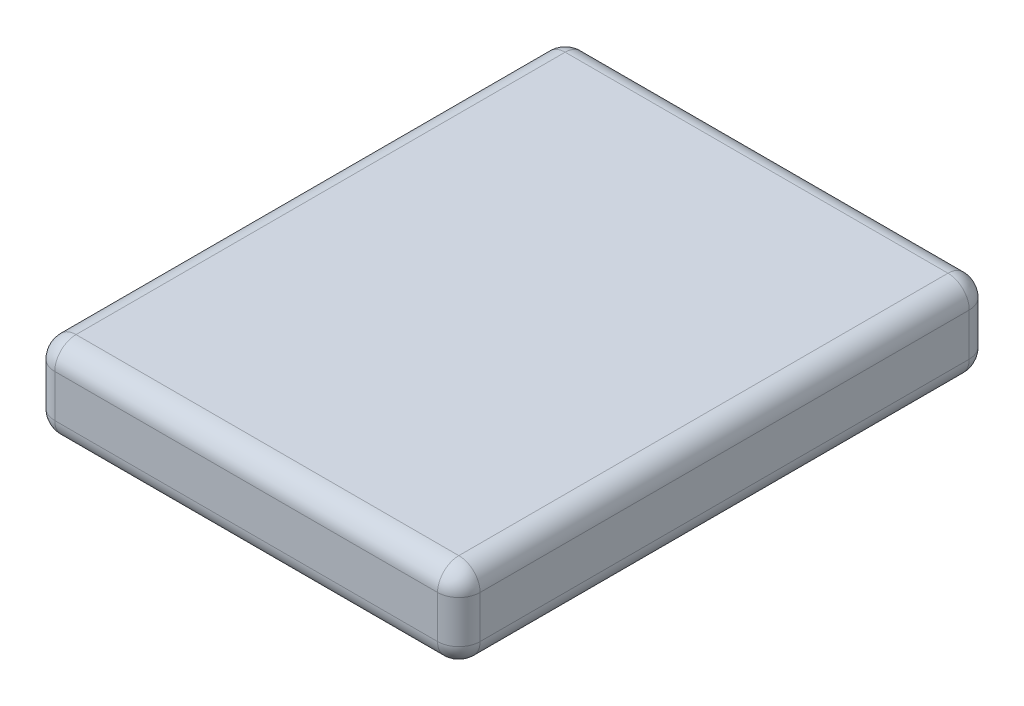
ISO-10303-21;
HEADER;
FILE_DESCRIPTION(('STEP AP214'),'2;1');
FILE_NAME('part.step','',(''),(''),'','','');
FILE_SCHEMA(('AUTOMOTIVE_DESIGN { 1 0 10303 214 1 1 1 1 }'));
ENDSEC;
DATA;
#1=APPLICATION_CONTEXT('core data for automotive mechanical design processes');
#2=APPLICATION_PROTOCOL_DEFINITION('international standard','automotive_design',2000,#1);
#3=PRODUCT_CONTEXT('',#1,'mechanical');
#4=PRODUCT('Part','Part','',(#3));
#5=PRODUCT_RELATED_PRODUCT_CATEGORY('part','',(#4));
#6=PRODUCT_DEFINITION_FORMATION('','',#4);
#7=PRODUCT_DEFINITION_CONTEXT('part definition',#1,'design');
#8=PRODUCT_DEFINITION('design','',#6,#7);
#9=PRODUCT_DEFINITION_SHAPE('','',#8);
#10=(LENGTH_UNIT() NAMED_UNIT(*) SI_UNIT(.MILLI.,.METRE.));
#11=(NAMED_UNIT(*) PLANE_ANGLE_UNIT() SI_UNIT($,.RADIAN.));
#12=(NAMED_UNIT(*) SI_UNIT($,.STERADIAN.) SOLID_ANGLE_UNIT());
#13=UNCERTAINTY_MEASURE_WITH_UNIT(LENGTH_MEASURE(1.E-05),#10,'distance_accuracy_value','');
#14=(GEOMETRIC_REPRESENTATION_CONTEXT(3) GLOBAL_UNCERTAINTY_ASSIGNED_CONTEXT((#13)) GLOBAL_UNIT_ASSIGNED_CONTEXT((#10,
#11,#12)) REPRESENTATION_CONTEXT('',''));
#15=CARTESIAN_POINT('',(0.,0.,0.));
#16=DIRECTION('',(0.,0.,1.));
#17=DIRECTION('',(1.,0.,0.));
#18=AXIS2_PLACEMENT_3D('',#15,#16,#17);
#19=CARTESIAN_POINT('',(9.99999999999999,4.,-12.5));
#20=DIRECTION('',(-1.,0.,0.));
#21=DIRECTION('',(0.,0.,1.));
#22=AXIS2_PLACEMENT_3D('',#19,#20,#21);
#23=PLANE('',#22);
#24=DIRECTION('',(0.,0.,-1.));
#25=VECTOR('',#24,1.);
#26=CARTESIAN_POINT('',(9.99999999999999,1.,-12.5));
#27=LINE('',#26,#25);
#28=CARTESIAN_POINT('',(10.,1.,11.5));
#29=VERTEX_POINT('',#28);
#30=CARTESIAN_POINT('',(9.99999999999999,1.,-11.5));
#31=VERTEX_POINT('',#30);
#32=EDGE_CURVE('E137',#29,#31,#27,.T.);
#33=ORIENTED_EDGE('',*,*,#32,.T.);
#34=DIRECTION('',(0.,-1.,0.));
#35=VECTOR('',#34,1.);
#36=CARTESIAN_POINT('',(9.99999999999999,4.,-11.5));
#37=LINE('',#36,#35);
#38=CARTESIAN_POINT('',(9.99999999999999,3.,-11.5));
#39=VERTEX_POINT('',#38);
#40=EDGE_CURVE('E186',#31,#39,#37,.F.);
#41=ORIENTED_EDGE('',*,*,#40,.T.);
#42=DIRECTION('',(0.,0.,-1.));
#43=VECTOR('',#42,1.);
#44=CARTESIAN_POINT('',(10.,3.,12.5));
#45=LINE('',#44,#43);
#46=CARTESIAN_POINT('',(10.,3.,11.5));
#47=VERTEX_POINT('',#46);
#48=EDGE_CURVE('E184',#39,#47,#45,.F.);
#49=ORIENTED_EDGE('',*,*,#48,.T.);
#50=DIRECTION('',(0.,-1.,0.));
#51=VECTOR('',#50,1.);
#52=CARTESIAN_POINT('',(10.,4.,11.5));
#53=LINE('',#52,#51);
#54=EDGE_CURVE('E182',#47,#29,#53,.T.);
#55=ORIENTED_EDGE('',*,*,#54,.T.);
#56=EDGE_LOOP('',(#33,#41,#49,#55));
#57=FACE_BOUND('',#56,.T.);
#58=ADVANCED_FACE('F37',(#57),#23,.F.);
#59=CARTESIAN_POINT('',(-10.,4.,-12.5));
#60=DIRECTION('',(0.,0.,1.));
#61=DIRECTION('',(1.,0.,0.));
#62=AXIS2_PLACEMENT_3D('',#59,#60,#61);
#63=PLANE('',#62);
#64=DIRECTION('',(-1.,0.,0.));
#65=VECTOR('',#64,1.);
#66=CARTESIAN_POINT('',(9.99999999999999,3.,-12.5));
#67=LINE('',#66,#65);
#68=CARTESIAN_POINT('',(-9.00000000000001,3.,-12.5));
#69=VERTEX_POINT('',#68);
#70=CARTESIAN_POINT('',(8.99999999999999,3.,-12.5));
#71=VERTEX_POINT('',#70);
#72=EDGE_CURVE('E60',#69,#71,#67,.F.);
#73=ORIENTED_EDGE('',*,*,#72,.T.);
#74=DIRECTION('',(0.,-1.,0.));
#75=VECTOR('',#74,1.);
#76=CARTESIAN_POINT('',(8.99999999999999,4.,-12.5));
#77=LINE('',#76,#75);
#78=CARTESIAN_POINT('',(8.99999999999999,1.,-12.5));
#79=VERTEX_POINT('',#78);
#80=EDGE_CURVE('E189',#71,#79,#77,.T.);
#81=ORIENTED_EDGE('',*,*,#80,.T.);
#82=DIRECTION('',(-1.,0.,0.));
#83=VECTOR('',#82,1.);
#84=CARTESIAN_POINT('',(-10.,1.,-12.5));
#85=LINE('',#84,#83);
#86=CARTESIAN_POINT('',(-9.00000000000001,1.,-12.5));
#87=VERTEX_POINT('',#86);
#88=EDGE_CURVE('E251',#79,#87,#85,.T.);
#89=ORIENTED_EDGE('',*,*,#88,.T.);
#90=DIRECTION('',(0.,-1.,0.));
#91=VECTOR('',#90,1.);
#92=CARTESIAN_POINT('',(-9.00000000000001,4.,-12.5));
#93=LINE('',#92,#91);
#94=EDGE_CURVE('E161',#87,#69,#93,.F.);
#95=ORIENTED_EDGE('',*,*,#94,.T.);
#96=EDGE_LOOP('',(#73,#81,#89,#95));
#97=FACE_BOUND('',#96,.T.);
#98=ADVANCED_FACE('F333',(#97),#63,.F.);
#99=CARTESIAN_POINT('',(-10.,4.,-12.5));
#100=DIRECTION('',(1.,0.,0.));
#101=DIRECTION('',(0.,0.,-1.));
#102=AXIS2_PLACEMENT_3D('',#99,#100,#101);
#103=PLANE('',#102);
#104=DIRECTION('',(0.,0.,1.));
#105=VECTOR('',#104,1.);
#106=CARTESIAN_POINT('',(-10.,3.,-12.5));
#107=LINE('',#106,#105);
#108=CARTESIAN_POINT('',(-10.,3.,11.5));
#109=VERTEX_POINT('',#108);
#110=CARTESIAN_POINT('',(-10.,3.,-11.5));
#111=VERTEX_POINT('',#110);
#112=EDGE_CURVE('E256',#109,#111,#107,.F.);
#113=ORIENTED_EDGE('',*,*,#112,.T.);
#114=DIRECTION('',(0.,-1.,0.));
#115=VECTOR('',#114,1.);
#116=CARTESIAN_POINT('',(-10.,4.,-11.5));
#117=LINE('',#116,#115);
#118=CARTESIAN_POINT('',(-10.,1.,-11.5));
#119=VERTEX_POINT('',#118);
#120=EDGE_CURVE('E261',#111,#119,#117,.T.);
#121=ORIENTED_EDGE('',*,*,#120,.T.);
#122=DIRECTION('',(0.,0.,1.));
#123=VECTOR('',#122,1.);
#124=CARTESIAN_POINT('',(-10.,1.,-12.5));
#125=LINE('',#124,#123);
#126=CARTESIAN_POINT('',(-10.,1.,11.5));
#127=VERTEX_POINT('',#126);
#128=EDGE_CURVE('E259',#119,#127,#125,.T.);
#129=ORIENTED_EDGE('',*,*,#128,.T.);
#130=DIRECTION('',(0.,-1.,0.));
#131=VECTOR('',#130,1.);
#132=CARTESIAN_POINT('',(-10.,4.,11.5));
#133=LINE('',#132,#131);
#134=EDGE_CURVE('E253',#127,#109,#133,.F.);
#135=ORIENTED_EDGE('',*,*,#134,.T.);
#136=EDGE_LOOP('',(#113,#121,#129,#135));
#137=FACE_BOUND('',#136,.T.);
#138=ADVANCED_FACE('F315',(#137),#103,.F.);
#139=CARTESIAN_POINT('',(-10.,4.,12.5));
#140=DIRECTION('',(0.,0.,-1.));
#141=DIRECTION('',(-1.,0.,0.));
#142=AXIS2_PLACEMENT_3D('',#139,#140,#141);
#143=PLANE('',#142);
#144=DIRECTION('',(1.,0.,0.));
#145=VECTOR('',#144,1.);
#146=CARTESIAN_POINT('',(-10.,1.,12.5));
#147=LINE('',#146,#145);
#148=CARTESIAN_POINT('',(-9.,1.,12.5));
#149=VERTEX_POINT('',#148);
#150=CARTESIAN_POINT('',(9.,1.,12.5));
#151=VERTEX_POINT('',#150);
#152=EDGE_CURVE('E266',#149,#151,#147,.T.);
#153=ORIENTED_EDGE('',*,*,#152,.T.);
#154=DIRECTION('',(0.,-1.,0.));
#155=VECTOR('',#154,1.);
#156=CARTESIAN_POINT('',(9.,4.,12.5));
#157=LINE('',#156,#155);
#158=CARTESIAN_POINT('',(9.,3.,12.5));
#159=VERTEX_POINT('',#158);
#160=EDGE_CURVE('E11',#151,#159,#157,.F.);
#161=ORIENTED_EDGE('',*,*,#160,.T.);
#162=DIRECTION('',(1.,0.,0.));
#163=VECTOR('',#162,1.);
#164=CARTESIAN_POINT('',(-9.,3.,12.5));
#165=LINE('',#164,#163);
#166=CARTESIAN_POINT('',(-9.,3.,12.5));
#167=VERTEX_POINT('',#166);
#168=EDGE_CURVE('E46',#159,#167,#165,.F.);
#169=ORIENTED_EDGE('',*,*,#168,.T.);
#170=DIRECTION('',(0.,-1.,0.));
#171=VECTOR('',#170,1.);
#172=CARTESIAN_POINT('',(-9.,4.,12.5));
#173=LINE('',#172,#171);
#174=EDGE_CURVE('E143',#167,#149,#173,.T.);
#175=ORIENTED_EDGE('',*,*,#174,.T.);
#176=EDGE_LOOP('',(#153,#161,#169,#175));
#177=FACE_BOUND('',#176,.T.);
#178=ADVANCED_FACE('F269',(#177),#143,.F.);
#179=CARTESIAN_POINT('',(0.,4.,0.));
#180=DIRECTION('',(0.,1.,0.));
#181=DIRECTION('',(0.,0.,1.));
#182=AXIS2_PLACEMENT_3D('',#179,#180,#181);
#183=PLANE('',#182);
#184=DIRECTION('',(0.,0.,-1.));
#185=VECTOR('',#184,1.);
#186=CARTESIAN_POINT('',(8.99999999999999,4.,-12.5));
#187=LINE('',#186,#185);
#188=CARTESIAN_POINT('',(9.,4.,11.5));
#189=VERTEX_POINT('',#188);
#190=CARTESIAN_POINT('',(8.99999999999999,4.,-11.5));
#191=VERTEX_POINT('',#190);
#192=EDGE_CURVE('E178',#189,#191,#187,.T.);
#193=ORIENTED_EDGE('',*,*,#192,.T.);
#194=DIRECTION('',(-1.,0.,0.));
#195=VECTOR('',#194,1.);
#196=CARTESIAN_POINT('',(-9.00000000000001,4.,-11.5));
#197=LINE('',#196,#195);
#198=CARTESIAN_POINT('',(-9.00000000000001,4.,-11.5));
#199=VERTEX_POINT('',#198);
#200=EDGE_CURVE('E180',#191,#199,#197,.T.);
#201=ORIENTED_EDGE('',*,*,#200,.T.);
#202=DIRECTION('',(0.,0.,1.));
#203=VECTOR('',#202,1.);
#204=CARTESIAN_POINT('',(-9.,4.,12.5));
#205=LINE('',#204,#203);
#206=CARTESIAN_POINT('',(-9.,4.,11.5));
#207=VERTEX_POINT('',#206);
#208=EDGE_CURVE('E264',#199,#207,#205,.T.);
#209=ORIENTED_EDGE('',*,*,#208,.T.);
#210=DIRECTION('',(1.,0.,0.));
#211=VECTOR('',#210,1.);
#212=CARTESIAN_POINT('',(10.,4.,11.5));
#213=LINE('',#212,#211);
#214=EDGE_CURVE('E176',#207,#189,#213,.T.);
#215=ORIENTED_EDGE('',*,*,#214,.T.);
#216=EDGE_LOOP('',(#193,#201,#209,#215));
#217=FACE_BOUND('',#216,.T.);
#218=ADVANCED_FACE('F305',(#217),#183,.T.);
#219=CARTESIAN_POINT('',(0.,0.,0.));
#220=DIRECTION('',(0.,1.,0.));
#221=DIRECTION('',(0.,0.,1.));
#222=AXIS2_PLACEMENT_3D('',#219,#220,#221);
#223=PLANE('',#222);
#224=DIRECTION('',(-1.,0.,0.));
#225=VECTOR('',#224,1.);
#226=CARTESIAN_POINT('',(0.,0.,-11.5));
#227=LINE('',#226,#225);
#228=CARTESIAN_POINT('',(-9.00000000000001,0.,-11.5));
#229=VERTEX_POINT('',#228);
#230=CARTESIAN_POINT('',(8.99999999999999,0.,-11.5));
#231=VERTEX_POINT('',#230);
#232=EDGE_CURVE('E160',#229,#231,#227,.F.);
#233=ORIENTED_EDGE('',*,*,#232,.T.);
#234=DIRECTION('',(0.,0.,-1.));
#235=VECTOR('',#234,1.);
#236=CARTESIAN_POINT('',(9.,0.,0.));
#237=LINE('',#236,#235);
#238=CARTESIAN_POINT('',(9.,0.,11.5));
#239=VERTEX_POINT('',#238);
#240=EDGE_CURVE('E134',#231,#239,#237,.F.);
#241=ORIENTED_EDGE('',*,*,#240,.T.);
#242=DIRECTION('',(1.,0.,0.));
#243=VECTOR('',#242,1.);
#244=CARTESIAN_POINT('',(0.,0.,11.5));
#245=LINE('',#244,#243);
#246=CARTESIAN_POINT('',(-9.,0.,11.5));
#247=VERTEX_POINT('',#246);
#248=EDGE_CURVE('E147',#239,#247,#245,.F.);
#249=ORIENTED_EDGE('',*,*,#248,.T.);
#250=DIRECTION('',(0.,0.,1.));
#251=VECTOR('',#250,1.);
#252=CARTESIAN_POINT('',(-9.,0.,0.));
#253=LINE('',#252,#251);
#254=EDGE_CURVE('E155',#247,#229,#253,.F.);
#255=ORIENTED_EDGE('',*,*,#254,.T.);
#256=EDGE_LOOP('',(#233,#241,#249,#255));
#257=FACE_BOUND('',#256,.T.);
#258=ADVANCED_FACE('F158',(#257),#223,.F.);
#259=CARTESIAN_POINT('',(-9.,3.,0.));
#260=DIRECTION('',(0.,0.,-1.));
#261=DIRECTION('',(-1.,0.,0.));
#262=AXIS2_PLACEMENT_3D('',#259,#260,#261);
#263=CYLINDRICAL_SURFACE('',#262,1.);
#264=ORIENTED_EDGE('',*,*,#208,.F.);
#265=CARTESIAN_POINT('',(-9.00000000000001,3.,-11.5));
#266=DIRECTION('',(0.,0.,-1.));
#267=DIRECTION('',(-1.,0.,0.));
#268=AXIS2_PLACEMENT_3D('',#265,#266,#267);
#269=CIRCLE('',#268,1.);
#270=EDGE_CURVE('E172',#199,#111,#269,.F.);
#271=ORIENTED_EDGE('',*,*,#270,.T.);
#272=ORIENTED_EDGE('',*,*,#112,.F.);
#273=CARTESIAN_POINT('',(-9.,3.,11.5));
#274=DIRECTION('',(0.,0.,-1.));
#275=DIRECTION('',(-1.,0.,0.));
#276=AXIS2_PLACEMENT_3D('',#273,#274,#275);
#277=CIRCLE('',#276,1.);
#278=EDGE_CURVE('E166',#109,#207,#277,.T.);
#279=ORIENTED_EDGE('',*,*,#278,.T.);
#280=EDGE_LOOP('',(#264,#271,#272,#279));
#281=FACE_BOUND('',#280,.T.);
#282=ADVANCED_FACE('F317',(#281),#263,.T.);
#283=CARTESIAN_POINT('',(-9.,4.,11.5));
#284=DIRECTION('',(0.,-1.,0.));
#285=DIRECTION('',(0.,0.,-1.));
#286=AXIS2_PLACEMENT_3D('',#283,#284,#285);
#287=CYLINDRICAL_SURFACE('',#286,1.);
#288=ORIENTED_EDGE('',*,*,#174,.F.);
#289=CARTESIAN_POINT('',(-9.,3.,11.5));
#290=DIRECTION('',(0.,-1.,0.));
#291=DIRECTION('',(0.,0.,-1.));
#292=AXIS2_PLACEMENT_3D('',#289,#290,#291);
#293=CIRCLE('',#292,1.);
#294=EDGE_CURVE('E174',#167,#109,#293,.T.);
#295=ORIENTED_EDGE('',*,*,#294,.T.);
#296=ORIENTED_EDGE('',*,*,#134,.F.);
#297=CARTESIAN_POINT('',(-9.,1.,11.5));
#298=DIRECTION('',(0.,-1.,0.));
#299=DIRECTION('',(0.,0.,-1.));
#300=AXIS2_PLACEMENT_3D('',#297,#298,#299);
#301=CIRCLE('',#300,1.);
#302=EDGE_CURVE('E236',#149,#127,#301,.T.);
#303=ORIENTED_EDGE('',*,*,#302,.F.);
#304=EDGE_LOOP('',(#288,#295,#296,#303));
#305=FACE_BOUND('',#304,.T.);
#306=ADVANCED_FACE('F273',(#305),#287,.T.);
#307=CARTESIAN_POINT('',(-9.00000000000001,4.,-11.5));
#308=DIRECTION('',(0.,-1.,0.));
#309=DIRECTION('',(0.,0.,-1.));
#310=AXIS2_PLACEMENT_3D('',#307,#308,#309);
#311=CYLINDRICAL_SURFACE('',#310,1.);
#312=ORIENTED_EDGE('',*,*,#120,.F.);
#313=CARTESIAN_POINT('',(-9.00000000000001,3.,-11.5));
#314=DIRECTION('',(0.,-1.,0.));
#315=DIRECTION('',(0.,0.,-1.));
#316=AXIS2_PLACEMENT_3D('',#313,#314,#315);
#317=CIRCLE('',#316,1.);
#318=EDGE_CURVE('E163',#111,#69,#317,.T.);
#319=ORIENTED_EDGE('',*,*,#318,.T.);
#320=ORIENTED_EDGE('',*,*,#94,.F.);
#321=CARTESIAN_POINT('',(-9.00000000000001,1.,-11.5));
#322=DIRECTION('',(0.,-1.,0.));
#323=DIRECTION('',(0.,0.,-1.));
#324=AXIS2_PLACEMENT_3D('',#321,#322,#323);
#325=CIRCLE('',#324,1.);
#326=EDGE_CURVE('E233',#119,#87,#325,.T.);
#327=ORIENTED_EDGE('',*,*,#326,.F.);
#328=EDGE_LOOP('',(#312,#319,#320,#327));
#329=FACE_BOUND('',#328,.T.);
#330=ADVANCED_FACE('F353',(#329),#311,.T.);
#331=CARTESIAN_POINT('',(-9.00000000000001,1.,-12.5));
#332=DIRECTION('',(0.,0.,1.));
#333=DIRECTION('',(1.,0.,0.));
#334=AXIS2_PLACEMENT_3D('',#331,#332,#333);
#335=CYLINDRICAL_SURFACE('',#334,1.);
#336=CARTESIAN_POINT('',(-9.,1.,11.5));
#337=DIRECTION('',(0.,0.,1.));
#338=DIRECTION('',(1.,0.,0.));
#339=AXIS2_PLACEMENT_3D('',#336,#337,#338);
#340=CIRCLE('',#339,1.);
#341=EDGE_CURVE('E239',#127,#247,#340,.T.);
#342=ORIENTED_EDGE('',*,*,#341,.F.);
#343=ORIENTED_EDGE('',*,*,#128,.F.);
#344=CARTESIAN_POINT('',(-9.00000000000001,1.,-11.5));
#345=DIRECTION('',(0.,0.,-1.));
#346=DIRECTION('',(-1.,0.,0.));
#347=AXIS2_PLACEMENT_3D('',#344,#345,#346);
#348=CIRCLE('',#347,1.);
#349=EDGE_CURVE('E227',#229,#119,#348,.T.);
#350=ORIENTED_EDGE('',*,*,#349,.F.);
#351=ORIENTED_EDGE('',*,*,#254,.F.);
#352=EDGE_LOOP('',(#342,#343,#350,#351));
#353=FACE_BOUND('',#352,.T.);
#354=ADVANCED_FACE('F279',(#353),#335,.T.);
#355=CARTESIAN_POINT('',(-9.,1.,11.5));
#356=DIRECTION('',(0.,0.,1.));
#357=DIRECTION('',(1.,0.,0.));
#358=AXIS2_PLACEMENT_3D('',#355,#356,#357);
#359=SPHERICAL_SURFACE('',#358,1.);
#360=ORIENTED_EDGE('',*,*,#302,.T.);
#361=ORIENTED_EDGE('',*,*,#341,.T.);
#362=CARTESIAN_POINT('',(-9.,1.,11.5));
#363=DIRECTION('',(-1.,0.,0.));
#364=DIRECTION('',(0.,0.,1.));
#365=AXIS2_PLACEMENT_3D('',#362,#363,#364);
#366=CIRCLE('',#365,1.);
#367=EDGE_CURVE('E152',#149,#247,#366,.F.);
#368=ORIENTED_EDGE('',*,*,#367,.F.);
#369=EDGE_LOOP('',(#360,#361,#368));
#370=FACE_BOUND('',#369,.T.);
#371=ADVANCED_FACE('F276',(#370),#359,.T.);
#372=CARTESIAN_POINT('',(-9.00000000000001,1.,-11.5));
#373=DIRECTION('',(0.,0.,1.));
#374=DIRECTION('',(1.,0.,0.));
#375=AXIS2_PLACEMENT_3D('',#372,#373,#374);
#376=SPHERICAL_SURFACE('',#375,1.);
#377=ORIENTED_EDGE('',*,*,#349,.T.);
#378=ORIENTED_EDGE('',*,*,#326,.T.);
#379=CARTESIAN_POINT('',(-9.00000000000001,1.,-11.5));
#380=DIRECTION('',(-1.,0.,0.));
#381=DIRECTION('',(0.,0.,1.));
#382=AXIS2_PLACEMENT_3D('',#379,#380,#381);
#383=CIRCLE('',#382,1.);
#384=EDGE_CURVE('E219',#229,#87,#383,.F.);
#385=ORIENTED_EDGE('',*,*,#384,.F.);
#386=EDGE_LOOP('',(#377,#378,#385));
#387=FACE_BOUND('',#386,.T.);
#388=ADVANCED_FACE('F283',(#387),#376,.T.);
#389=CARTESIAN_POINT('',(-10.,1.,11.5));
#390=DIRECTION('',(1.,0.,0.));
#391=DIRECTION('',(0.,0.,-1.));
#392=AXIS2_PLACEMENT_3D('',#389,#390,#391);
#393=CYLINDRICAL_SURFACE('',#392,1.);
#394=ORIENTED_EDGE('',*,*,#248,.F.);
#395=CARTESIAN_POINT('',(9.,1.,11.5));
#396=DIRECTION('',(1.,0.,0.));
#397=DIRECTION('',(0.,0.,-1.));
#398=AXIS2_PLACEMENT_3D('',#395,#396,#397);
#399=CIRCLE('',#398,1.);
#400=EDGE_CURVE('E150',#239,#151,#399,.F.);
#401=ORIENTED_EDGE('',*,*,#400,.T.);
#402=ORIENTED_EDGE('',*,*,#152,.F.);
#403=ORIENTED_EDGE('',*,*,#367,.T.);
#404=EDGE_LOOP('',(#394,#401,#402,#403));
#405=FACE_BOUND('',#404,.T.);
#406=ADVANCED_FACE('F148',(#405),#393,.T.);
#407=CARTESIAN_POINT('',(-10.,1.,-11.5));
#408=DIRECTION('',(-1.,0.,0.));
#409=DIRECTION('',(0.,0.,1.));
#410=AXIS2_PLACEMENT_3D('',#407,#408,#409);
#411=CYLINDRICAL_SURFACE('',#410,1.);
#412=ORIENTED_EDGE('',*,*,#88,.F.);
#413=CARTESIAN_POINT('',(8.99999999999999,1.,-11.5));
#414=DIRECTION('',(-1.,0.,0.));
#415=DIRECTION('',(0.,0.,1.));
#416=AXIS2_PLACEMENT_3D('',#413,#414,#415);
#417=CIRCLE('',#416,1.);
#418=EDGE_CURVE('E164',#79,#231,#417,.T.);
#419=ORIENTED_EDGE('',*,*,#418,.T.);
#420=ORIENTED_EDGE('',*,*,#232,.F.);
#421=ORIENTED_EDGE('',*,*,#384,.T.);
#422=EDGE_LOOP('',(#412,#419,#420,#421));
#423=FACE_BOUND('',#422,.T.);
#424=ADVANCED_FACE('F284',(#423),#411,.T.);
#425=CARTESIAN_POINT('',(8.99999999999999,1.,-12.5));
#426=DIRECTION('',(0.,0.,-1.));
#427=DIRECTION('',(-1.,0.,0.));
#428=AXIS2_PLACEMENT_3D('',#425,#426,#427);
#429=CYLINDRICAL_SURFACE('',#428,1.);
#430=ORIENTED_EDGE('',*,*,#240,.F.);
#431=CARTESIAN_POINT('',(8.99999999999999,1.,-11.5));
#432=DIRECTION('',(0.,0.,-1.));
#433=DIRECTION('',(-1.,0.,0.));
#434=AXIS2_PLACEMENT_3D('',#431,#432,#433);
#435=CIRCLE('',#434,1.);
#436=EDGE_CURVE('E142',#231,#31,#435,.F.);
#437=ORIENTED_EDGE('',*,*,#436,.T.);
#438=ORIENTED_EDGE('',*,*,#32,.F.);
#439=CARTESIAN_POINT('',(9.,1.,11.5));
#440=DIRECTION('',(0.,0.,-1.));
#441=DIRECTION('',(-1.,0.,0.));
#442=AXIS2_PLACEMENT_3D('',#439,#440,#441);
#443=CIRCLE('',#442,1.);
#444=EDGE_CURVE('E129',#29,#239,#443,.T.);
#445=ORIENTED_EDGE('',*,*,#444,.T.);
#446=EDGE_LOOP('',(#430,#437,#438,#445));
#447=FACE_BOUND('',#446,.T.);
#448=ADVANCED_FACE('F131',(#447),#429,.T.);
#449=CARTESIAN_POINT('',(9.,1.,11.5));
#450=DIRECTION('',(0.,0.,1.));
#451=DIRECTION('',(1.,0.,0.));
#452=AXIS2_PLACEMENT_3D('',#449,#450,#451);
#453=SPHERICAL_SURFACE('',#452,1.);
#454=ORIENTED_EDGE('',*,*,#400,.F.);
#455=ORIENTED_EDGE('',*,*,#444,.F.);
#456=CARTESIAN_POINT('',(9.,1.,11.5));
#457=DIRECTION('',(0.,1.,0.));
#458=DIRECTION('',(0.,0.,1.));
#459=AXIS2_PLACEMENT_3D('',#456,#457,#458);
#460=CIRCLE('',#459,1.);
#461=EDGE_CURVE('E41',#151,#29,#460,.T.);
#462=ORIENTED_EDGE('',*,*,#461,.F.);
#463=EDGE_LOOP('',(#454,#455,#462));
#464=FACE_BOUND('',#463,.T.);
#465=ADVANCED_FACE('F39',(#464),#453,.T.);
#466=CARTESIAN_POINT('',(-9.,3.,11.5));
#467=DIRECTION('',(0.,0.,1.));
#468=DIRECTION('',(1.,0.,0.));
#469=AXIS2_PLACEMENT_3D('',#466,#467,#468);
#470=SPHERICAL_SURFACE('',#469,1.);
#471=ORIENTED_EDGE('',*,*,#278,.F.);
#472=ORIENTED_EDGE('',*,*,#294,.F.);
#473=CARTESIAN_POINT('',(-9.,3.,11.5));
#474=DIRECTION('',(1.,0.,0.));
#475=DIRECTION('',(0.,0.,-1.));
#476=AXIS2_PLACEMENT_3D('',#473,#474,#475);
#477=CIRCLE('',#476,1.);
#478=EDGE_CURVE('E214',#207,#167,#477,.T.);
#479=ORIENTED_EDGE('',*,*,#478,.F.);
#480=EDGE_LOOP('',(#471,#472,#479));
#481=FACE_BOUND('',#480,.T.);
#482=ADVANCED_FACE('F312',(#481),#470,.T.);
#483=CARTESIAN_POINT('',(9.,4.,11.5));
#484=DIRECTION('',(0.,-1.,0.));
#485=DIRECTION('',(0.,0.,-1.));
#486=AXIS2_PLACEMENT_3D('',#483,#484,#485);
#487=CYLINDRICAL_SURFACE('',#486,1.);
#488=ORIENTED_EDGE('',*,*,#461,.T.);
#489=ORIENTED_EDGE('',*,*,#54,.F.);
#490=CARTESIAN_POINT('',(9.,3.,11.5));
#491=DIRECTION('',(0.,1.,0.));
#492=DIRECTION('',(0.,0.,1.));
#493=AXIS2_PLACEMENT_3D('',#490,#491,#492);
#494=CIRCLE('',#493,1.);
#495=EDGE_CURVE('E212',#159,#47,#494,.T.);
#496=ORIENTED_EDGE('',*,*,#495,.F.);
#497=ORIENTED_EDGE('',*,*,#160,.F.);
#498=EDGE_LOOP('',(#488,#489,#496,#497));
#499=FACE_BOUND('',#498,.T.);
#500=ADVANCED_FACE('F299',(#499),#487,.T.);
#501=CARTESIAN_POINT('',(0.,3.,11.5));
#502=DIRECTION('',(-1.,0.,0.));
#503=DIRECTION('',(0.,0.,1.));
#504=AXIS2_PLACEMENT_3D('',#501,#502,#503);
#505=CYLINDRICAL_SURFACE('',#504,1.);
#506=ORIENTED_EDGE('',*,*,#478,.T.);
#507=ORIENTED_EDGE('',*,*,#168,.F.);
#508=CARTESIAN_POINT('',(9.,3.,11.5));
#509=DIRECTION('',(1.,0.,0.));
#510=DIRECTION('',(0.,0.,-1.));
#511=AXIS2_PLACEMENT_3D('',#508,#509,#510);
#512=CIRCLE('',#511,1.);
#513=EDGE_CURVE('E209',#189,#159,#512,.T.);
#514=ORIENTED_EDGE('',*,*,#513,.F.);
#515=ORIENTED_EDGE('',*,*,#214,.F.);
#516=EDGE_LOOP('',(#506,#507,#514,#515));
#517=FACE_BOUND('',#516,.T.);
#518=ADVANCED_FACE('F303',(#517),#505,.T.);
#519=CARTESIAN_POINT('',(9.,3.,11.5));
#520=DIRECTION('',(0.,0.,1.));
#521=DIRECTION('',(1.,0.,0.));
#522=AXIS2_PLACEMENT_3D('',#519,#520,#521);
#523=SPHERICAL_SURFACE('',#522,1.);
#524=ORIENTED_EDGE('',*,*,#513,.T.);
#525=ORIENTED_EDGE('',*,*,#495,.T.);
#526=CARTESIAN_POINT('',(9.,3.,11.5));
#527=DIRECTION('',(0.,0.,1.));
#528=DIRECTION('',(1.,0.,0.));
#529=AXIS2_PLACEMENT_3D('',#526,#527,#528);
#530=CIRCLE('',#529,1.);
#531=EDGE_CURVE('E206',#189,#47,#530,.F.);
#532=ORIENTED_EDGE('',*,*,#531,.F.);
#533=EDGE_LOOP('',(#524,#525,#532));
#534=FACE_BOUND('',#533,.T.);
#535=ADVANCED_FACE('F301',(#534),#523,.T.);
#536=CARTESIAN_POINT('',(-9.00000000000001,3.,-11.5));
#537=DIRECTION('',(0.,0.,1.));
#538=DIRECTION('',(1.,0.,0.));
#539=AXIS2_PLACEMENT_3D('',#536,#537,#538);
#540=SPHERICAL_SURFACE('',#539,1.);
#541=ORIENTED_EDGE('',*,*,#318,.F.);
#542=ORIENTED_EDGE('',*,*,#270,.F.);
#543=CARTESIAN_POINT('',(-9.00000000000001,3.,-11.5));
#544=DIRECTION('',(1.,0.,0.));
#545=DIRECTION('',(0.,0.,-1.));
#546=AXIS2_PLACEMENT_3D('',#543,#544,#545);
#547=CIRCLE('',#546,1.);
#548=EDGE_CURVE('E203',#69,#199,#547,.T.);
#549=ORIENTED_EDGE('',*,*,#548,.F.);
#550=EDGE_LOOP('',(#541,#542,#549));
#551=FACE_BOUND('',#550,.T.);
#552=ADVANCED_FACE('F321',(#551),#540,.T.);
#553=CARTESIAN_POINT('',(9.,3.,0.));
#554=DIRECTION('',(0.,0.,1.));
#555=DIRECTION('',(1.,0.,0.));
#556=AXIS2_PLACEMENT_3D('',#553,#554,#555);
#557=CYLINDRICAL_SURFACE('',#556,1.);
#558=ORIENTED_EDGE('',*,*,#531,.T.);
#559=ORIENTED_EDGE('',*,*,#48,.F.);
#560=CARTESIAN_POINT('',(8.99999999999999,3.,-11.5));
#561=DIRECTION('',(0.,0.,-1.));
#562=DIRECTION('',(-1.,0.,0.));
#563=AXIS2_PLACEMENT_3D('',#560,#561,#562);
#564=CIRCLE('',#563,1.);
#565=EDGE_CURVE('E200',#191,#39,#564,.T.);
#566=ORIENTED_EDGE('',*,*,#565,.F.);
#567=ORIENTED_EDGE('',*,*,#192,.F.);
#568=EDGE_LOOP('',(#558,#559,#566,#567));
#569=FACE_BOUND('',#568,.T.);
#570=ADVANCED_FACE('F296',(#569),#557,.T.);
#571=CARTESIAN_POINT('',(0.,3.,-11.5));
#572=DIRECTION('',(1.,0.,0.));
#573=DIRECTION('',(0.,0.,-1.));
#574=AXIS2_PLACEMENT_3D('',#571,#572,#573);
#575=CYLINDRICAL_SURFACE('',#574,1.);
#576=ORIENTED_EDGE('',*,*,#548,.T.);
#577=ORIENTED_EDGE('',*,*,#200,.F.);
#578=CARTESIAN_POINT('',(8.99999999999999,3.,-11.5));
#579=DIRECTION('',(1.,0.,0.));
#580=DIRECTION('',(0.,0.,-1.));
#581=AXIS2_PLACEMENT_3D('',#578,#579,#580);
#582=CIRCLE('',#581,1.);
#583=EDGE_CURVE('E197',#71,#191,#582,.T.);
#584=ORIENTED_EDGE('',*,*,#583,.F.);
#585=ORIENTED_EDGE('',*,*,#72,.F.);
#586=EDGE_LOOP('',(#576,#577,#584,#585));
#587=FACE_BOUND('',#586,.T.);
#588=ADVANCED_FACE('F323',(#587),#575,.T.);
#589=CARTESIAN_POINT('',(8.99999999999999,3.,-11.5));
#590=DIRECTION('',(0.,0.,1.));
#591=DIRECTION('',(1.,0.,0.));
#592=AXIS2_PLACEMENT_3D('',#589,#590,#591);
#593=SPHERICAL_SURFACE('',#592,1.);
#594=ORIENTED_EDGE('',*,*,#583,.T.);
#595=ORIENTED_EDGE('',*,*,#565,.T.);
#596=CARTESIAN_POINT('',(8.99999999999999,3.,-11.5));
#597=DIRECTION('',(0.,1.,0.));
#598=DIRECTION('',(0.,0.,1.));
#599=AXIS2_PLACEMENT_3D('',#596,#597,#598);
#600=CIRCLE('',#599,1.);
#601=EDGE_CURVE('E194',#71,#39,#600,.F.);
#602=ORIENTED_EDGE('',*,*,#601,.F.);
#603=EDGE_LOOP('',(#594,#595,#602));
#604=FACE_BOUND('',#603,.T.);
#605=ADVANCED_FACE('F292',(#604),#593,.T.);
#606=CARTESIAN_POINT('',(8.99999999999999,4.,-11.5));
#607=DIRECTION('',(0.,-1.,0.));
#608=DIRECTION('',(0.,0.,-1.));
#609=AXIS2_PLACEMENT_3D('',#606,#607,#608);
#610=CYLINDRICAL_SURFACE('',#609,1.);
#611=ORIENTED_EDGE('',*,*,#601,.T.);
#612=ORIENTED_EDGE('',*,*,#40,.F.);
#613=CARTESIAN_POINT('',(8.99999999999999,1.,-11.5));
#614=DIRECTION('',(0.,-1.,0.));
#615=DIRECTION('',(0.,0.,-1.));
#616=AXIS2_PLACEMENT_3D('',#613,#614,#615);
#617=CIRCLE('',#616,1.);
#618=EDGE_CURVE('E192',#79,#31,#617,.T.);
#619=ORIENTED_EDGE('',*,*,#618,.F.);
#620=ORIENTED_EDGE('',*,*,#80,.F.);
#621=EDGE_LOOP('',(#611,#612,#619,#620));
#622=FACE_BOUND('',#621,.T.);
#623=ADVANCED_FACE('F289',(#622),#610,.T.);
#624=CARTESIAN_POINT('',(8.99999999999999,1.,-11.5));
#625=DIRECTION('',(0.,0.,1.));
#626=DIRECTION('',(1.,0.,0.));
#627=AXIS2_PLACEMENT_3D('',#624,#625,#626);
#628=SPHERICAL_SURFACE('',#627,1.);
#629=ORIENTED_EDGE('',*,*,#436,.F.);
#630=ORIENTED_EDGE('',*,*,#418,.F.);
#631=ORIENTED_EDGE('',*,*,#618,.T.);
#632=EDGE_LOOP('',(#629,#630,#631));
#633=FACE_BOUND('',#632,.T.);
#634=ADVANCED_FACE('F286',(#633),#628,.T.);
#635=CLOSED_SHELL('',(#58,#98,#138,#178,#218,#258,#282,#306,#330,#354,#371,#388,#406,#424,#448,
#465,#482,#500,#518,#535,#552,#570,#588,#605,#623,#634));
#636=MANIFOLD_SOLID_BREP('B2',#635);
#637=ADVANCED_BREP_SHAPE_REPRESENTATION('',(#18,#636),#14);
#638=SHAPE_DEFINITION_REPRESENTATION(#9,#637);
ENDSEC;
END-ISO-10303-21;
